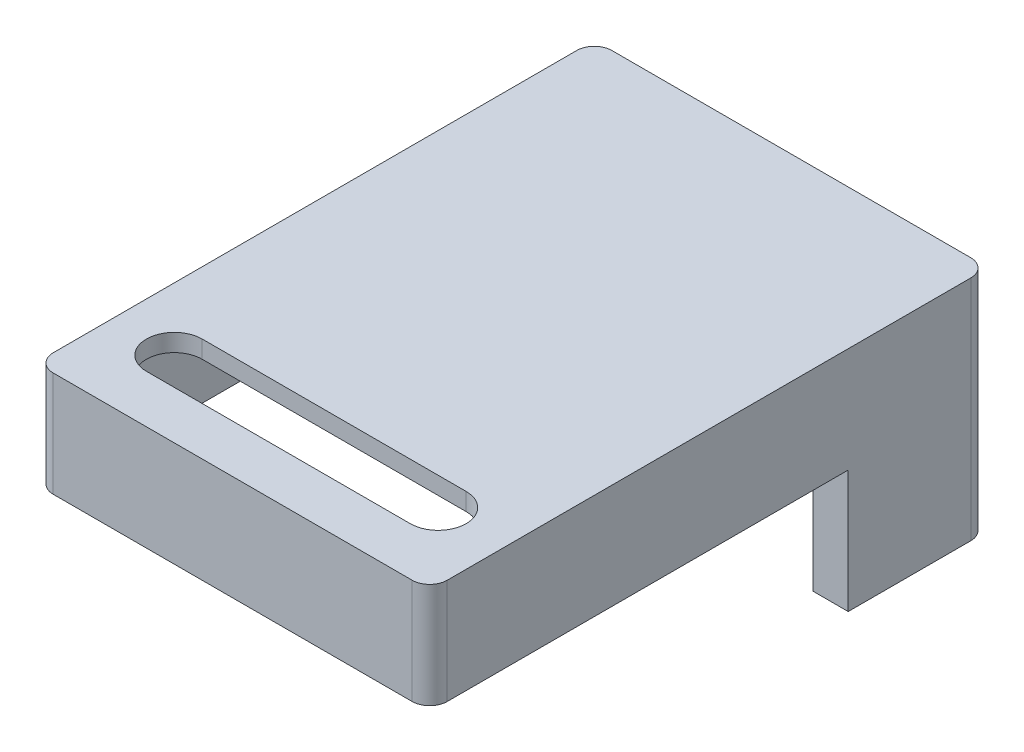
ISO-10303-21;
HEADER;
FILE_DESCRIPTION(('STEP AP214'),'2;1');
FILE_NAME('part.step','',(''),(''),'','','');
FILE_SCHEMA(('AUTOMOTIVE_DESIGN { 1 0 10303 214 1 1 1 1 }'));
ENDSEC;
DATA;
#1=APPLICATION_CONTEXT('core data for automotive mechanical design processes');
#2=APPLICATION_PROTOCOL_DEFINITION('international standard','automotive_design',2000,#1);
#3=PRODUCT_CONTEXT('',#1,'mechanical');
#4=PRODUCT('Part','Part','',(#3));
#5=PRODUCT_RELATED_PRODUCT_CATEGORY('part','',(#4));
#6=PRODUCT_DEFINITION_FORMATION('','',#4);
#7=PRODUCT_DEFINITION_CONTEXT('part definition',#1,'design');
#8=PRODUCT_DEFINITION('design','',#6,#7);
#9=PRODUCT_DEFINITION_SHAPE('','',#8);
#10=(LENGTH_UNIT() NAMED_UNIT(*) SI_UNIT(.MILLI.,.METRE.));
#11=(NAMED_UNIT(*) PLANE_ANGLE_UNIT() SI_UNIT($,.RADIAN.));
#12=(NAMED_UNIT(*) SI_UNIT($,.STERADIAN.) SOLID_ANGLE_UNIT());
#13=UNCERTAINTY_MEASURE_WITH_UNIT(LENGTH_MEASURE(1.E-05),#10,'distance_accuracy_value','');
#14=(GEOMETRIC_REPRESENTATION_CONTEXT(3) GLOBAL_UNCERTAINTY_ASSIGNED_CONTEXT((#13)) GLOBAL_UNIT_ASSIGNED_CONTEXT((#10,
#11,#12)) REPRESENTATION_CONTEXT('',''));
#15=CARTESIAN_POINT('',(0.,0.,0.));
#16=DIRECTION('',(0.,0.,1.));
#17=DIRECTION('',(1.,0.,0.));
#18=AXIS2_PLACEMENT_3D('',#15,#16,#17);
#19=CARTESIAN_POINT('',(0.,0.,0.));
#20=DIRECTION('',(0.,1.,0.));
#21=DIRECTION('',(0.,0.,1.));
#22=AXIS2_PLACEMENT_3D('',#19,#20,#21);
#23=PLANE('',#22);
#24=DIRECTION('',(-1.,0.,0.));
#25=VECTOR('',#24,1.);
#26=CARTESIAN_POINT('',(0.,0.,-15.));
#27=LINE('',#26,#25);
#28=CARTESIAN_POINT('',(-10.5,0.,-15.));
#29=VERTEX_POINT('',#28);
#30=CARTESIAN_POINT('',(-11.25,0.,-15.));
#31=VERTEX_POINT('',#30);
#32=EDGE_CURVE('E275',#29,#31,#27,.T.);
#33=ORIENTED_EDGE('',*,*,#32,.F.);
#34=DIRECTION('',(0.,0.,1.));
#35=VECTOR('',#34,1.);
#36=CARTESIAN_POINT('',(-10.5,0.,0.));
#37=LINE('',#36,#35);
#38=CARTESIAN_POINT('',(-10.5,0.,7.65));
#39=VERTEX_POINT('',#38);
#40=EDGE_CURVE('E290',#29,#39,#37,.T.);
#41=ORIENTED_EDGE('',*,*,#40,.T.);
#42=CARTESIAN_POINT('',(-10.,0.,7.65));
#43=DIRECTION('',(0.,1.,0.));
#44=DIRECTION('',(0.,0.,1.));
#45=AXIS2_PLACEMENT_3D('',#42,#43,#44);
#46=CIRCLE('',#45,0.5);
#47=CARTESIAN_POINT('',(-10.,0.,8.15));
#48=VERTEX_POINT('',#47);
#49=EDGE_CURVE('E309',#39,#48,#46,.T.);
#50=ORIENTED_EDGE('',*,*,#49,.T.);
#51=DIRECTION('',(1.,0.,0.));
#52=VECTOR('',#51,1.);
#53=CARTESIAN_POINT('',(0.,0.,8.15));
#54=LINE('',#53,#52);
#55=CARTESIAN_POINT('',(10.,0.,8.15));
#56=VERTEX_POINT('',#55);
#57=EDGE_CURVE('E467',#48,#56,#54,.T.);
#58=ORIENTED_EDGE('',*,*,#57,.T.);
#59=CARTESIAN_POINT('',(10.,0.,7.65));
#60=DIRECTION('',(0.,1.,0.));
#61=DIRECTION('',(0.,0.,1.));
#62=AXIS2_PLACEMENT_3D('',#59,#60,#61);
#63=CIRCLE('',#62,0.5);
#64=CARTESIAN_POINT('',(10.5,0.,7.65));
#65=VERTEX_POINT('',#64);
#66=EDGE_CURVE('E464',#56,#65,#63,.T.);
#67=ORIENTED_EDGE('',*,*,#66,.T.);
#68=DIRECTION('',(0.,0.,1.));
#69=VECTOR('',#68,1.);
#70=CARTESIAN_POINT('',(10.5,0.,0.));
#71=LINE('',#70,#69);
#72=CARTESIAN_POINT('',(10.5,0.,-15.));
#73=VERTEX_POINT('',#72);
#74=EDGE_CURVE('E286',#73,#65,#71,.T.);
#75=ORIENTED_EDGE('',*,*,#74,.F.);
#76=DIRECTION('',(1.,0.,0.));
#77=VECTOR('',#76,1.);
#78=CARTESIAN_POINT('',(0.,0.,-15.));
#79=LINE('',#78,#77);
#80=CARTESIAN_POINT('',(11.25,0.,-15.));
#81=VERTEX_POINT('',#80);
#82=EDGE_CURVE('E279',#73,#81,#79,.T.);
#83=ORIENTED_EDGE('',*,*,#82,.T.);
#84=DIRECTION('',(0.,0.,1.));
#85=VECTOR('',#84,1.);
#86=CARTESIAN_POINT('',(11.25,0.,0.));
#87=LINE('',#86,#85);
#88=CARTESIAN_POINT('',(11.25,0.,7.9000000000056));
#89=VERTEX_POINT('',#88);
#90=EDGE_CURVE('E451',#81,#89,#87,.T.);
#91=ORIENTED_EDGE('',*,*,#90,.T.);
#92=CARTESIAN_POINT('',(10.25,0.,7.90000000000561));
#93=DIRECTION('',(0.,1.,0.));
#94=DIRECTION('',(0.,0.,1.));
#95=AXIS2_PLACEMENT_3D('',#92,#93,#94);
#96=CIRCLE('',#95,1.);
#97=CARTESIAN_POINT('',(10.25,0.,8.90000000000561));
#98=VERTEX_POINT('',#97);
#99=EDGE_CURVE('E460',#89,#98,#96,.F.);
#100=ORIENTED_EDGE('',*,*,#99,.T.);
#101=DIRECTION('',(1.,0.,0.));
#102=VECTOR('',#101,1.);
#103=CARTESIAN_POINT('',(0.,0.,8.90000000000561));
#104=LINE('',#103,#102);
#105=CARTESIAN_POINT('',(-10.25,0.,8.90000000000561));
#106=VERTEX_POINT('',#105);
#107=EDGE_CURVE('E444',#106,#98,#104,.T.);
#108=ORIENTED_EDGE('',*,*,#107,.F.);
#109=CARTESIAN_POINT('',(-10.25,0.,7.90000000000561));
#110=DIRECTION('',(0.,1.,0.));
#111=DIRECTION('',(0.,0.,1.));
#112=AXIS2_PLACEMENT_3D('',#109,#110,#111);
#113=CIRCLE('',#112,1.);
#114=CARTESIAN_POINT('',(-11.25,0.,7.9000000000056));
#115=VERTEX_POINT('',#114);
#116=EDGE_CURVE('E442',#115,#106,#113,.T.);
#117=ORIENTED_EDGE('',*,*,#116,.F.);
#118=DIRECTION('',(0.,0.,1.));
#119=VECTOR('',#118,1.);
#120=CARTESIAN_POINT('',(-11.25,0.,0.));
#121=LINE('',#120,#119);
#122=EDGE_CURVE('E438',#31,#115,#121,.T.);
#123=ORIENTED_EDGE('',*,*,#122,.F.);
#124=EDGE_LOOP('',(#33,#41,#50,#58,#67,#75,#83,#91,#100,#108,#117,#123));
#125=FACE_BOUND('',#124,.T.);
#126=ADVANCED_FACE('F34',(#125),#23,.F.);
#127=CARTESIAN_POINT('',(10.,5.,7.65));
#128=DIRECTION('',(0.,-1.,0.));
#129=DIRECTION('',(0.,0.,-1.));
#130=AXIS2_PLACEMENT_3D('',#127,#128,#129);
#131=CYLINDRICAL_SURFACE('',#130,0.5);
#132=ORIENTED_EDGE('',*,*,#66,.F.);
#133=DIRECTION('',(0.,-1.,0.));
#134=VECTOR('',#133,1.);
#135=CARTESIAN_POINT('',(10.,5.,8.15));
#136=LINE('',#135,#134);
#137=CARTESIAN_POINT('',(10.,5.,8.15));
#138=VERTEX_POINT('',#137);
#139=EDGE_CURVE('E486',#138,#56,#136,.T.);
#140=ORIENTED_EDGE('',*,*,#139,.F.);
#141=CARTESIAN_POINT('',(10.,5.,7.65));
#142=DIRECTION('',(0.,1.,0.));
#143=DIRECTION('',(0.,0.,1.));
#144=AXIS2_PLACEMENT_3D('',#141,#142,#143);
#145=CIRCLE('',#144,0.5);
#146=CARTESIAN_POINT('',(10.5,5.,7.65));
#147=VERTEX_POINT('',#146);
#148=EDGE_CURVE('E289',#138,#147,#145,.T.);
#149=ORIENTED_EDGE('',*,*,#148,.T.);
#150=DIRECTION('',(0.,-1.,0.));
#151=VECTOR('',#150,1.);
#152=CARTESIAN_POINT('',(10.5,5.,7.65));
#153=LINE('',#152,#151);
#154=EDGE_CURVE('E297',#147,#65,#153,.T.);
#155=ORIENTED_EDGE('',*,*,#154,.T.);
#156=EDGE_LOOP('',(#132,#140,#149,#155));
#157=FACE_BOUND('',#156,.T.);
#158=ADVANCED_FACE('F337',(#157),#131,.F.);
#159=CARTESIAN_POINT('',(0.,5.,8.15));
#160=DIRECTION('',(0.,0.,-1.));
#161=DIRECTION('',(-1.,0.,0.));
#162=AXIS2_PLACEMENT_3D('',#159,#160,#161);
#163=PLANE('',#162);
#164=ORIENTED_EDGE('',*,*,#57,.F.);
#165=DIRECTION('',(0.,-1.,0.));
#166=VECTOR('',#165,1.);
#167=CARTESIAN_POINT('',(-10.,5.,8.15));
#168=LINE('',#167,#166);
#169=CARTESIAN_POINT('',(-10.,5.,8.15));
#170=VERTEX_POINT('',#169);
#171=EDGE_CURVE('E484',#170,#48,#168,.T.);
#172=ORIENTED_EDGE('',*,*,#171,.F.);
#173=DIRECTION('',(1.,0.,0.));
#174=VECTOR('',#173,1.);
#175=CARTESIAN_POINT('',(0.,5.,8.15));
#176=LINE('',#175,#174);
#177=EDGE_CURVE('E521',#170,#138,#176,.T.);
#178=ORIENTED_EDGE('',*,*,#177,.T.);
#179=ORIENTED_EDGE('',*,*,#139,.T.);
#180=EDGE_LOOP('',(#164,#172,#178,#179));
#181=FACE_BOUND('',#180,.T.);
#182=ADVANCED_FACE('F343',(#181),#163,.T.);
#183=CARTESIAN_POINT('',(-10.,5.,7.65));
#184=DIRECTION('',(0.,-1.,0.));
#185=DIRECTION('',(0.,0.,-1.));
#186=AXIS2_PLACEMENT_3D('',#183,#184,#185);
#187=CYLINDRICAL_SURFACE('',#186,0.5);
#188=ORIENTED_EDGE('',*,*,#49,.F.);
#189=DIRECTION('',(0.,-1.,0.));
#190=VECTOR('',#189,1.);
#191=CARTESIAN_POINT('',(-10.5,5.,7.65));
#192=LINE('',#191,#190);
#193=CARTESIAN_POINT('',(-10.5,5.,7.65));
#194=VERTEX_POINT('',#193);
#195=EDGE_CURVE('E303',#194,#39,#192,.T.);
#196=ORIENTED_EDGE('',*,*,#195,.F.);
#197=CARTESIAN_POINT('',(-10.,5.,7.65));
#198=DIRECTION('',(0.,1.,0.));
#199=DIRECTION('',(0.,0.,1.));
#200=AXIS2_PLACEMENT_3D('',#197,#198,#199);
#201=CIRCLE('',#200,0.5);
#202=EDGE_CURVE('E524',#194,#170,#201,.T.);
#203=ORIENTED_EDGE('',*,*,#202,.T.);
#204=ORIENTED_EDGE('',*,*,#171,.T.);
#205=EDGE_LOOP('',(#188,#196,#203,#204));
#206=FACE_BOUND('',#205,.T.);
#207=ADVANCED_FACE('F385',(#206),#187,.F.);
#208=CARTESIAN_POINT('',(-10.5,5.,0.));
#209=DIRECTION('',(1.,0.,0.));
#210=DIRECTION('',(0.,0.,-1.));
#211=AXIS2_PLACEMENT_3D('',#208,#209,#210);
#212=PLANE('',#211);
#213=ORIENTED_EDGE('',*,*,#40,.F.);
#214=DIRECTION('',(0.,-1.,0.));
#215=VECTOR('',#214,1.);
#216=CARTESIAN_POINT('',(-10.5,5.,-15.));
#217=LINE('',#216,#215);
#218=CARTESIAN_POINT('',(-10.5,5.,-15.));
#219=VERTEX_POINT('',#218);
#220=EDGE_CURVE('E300',#219,#29,#217,.T.);
#221=ORIENTED_EDGE('',*,*,#220,.F.);
#222=DIRECTION('',(0.,0.,1.));
#223=VECTOR('',#222,1.);
#224=CARTESIAN_POINT('',(-10.5,5.,0.));
#225=LINE('',#224,#223);
#226=EDGE_CURVE('E527',#219,#194,#225,.T.);
#227=ORIENTED_EDGE('',*,*,#226,.T.);
#228=ORIENTED_EDGE('',*,*,#195,.T.);
#229=EDGE_LOOP('',(#213,#221,#227,#228));
#230=FACE_BOUND('',#229,.T.);
#231=ADVANCED_FACE('F381',(#230),#212,.T.);
#232=CARTESIAN_POINT('',(0.,5.,-15.));
#233=DIRECTION('',(0.,0.,1.));
#234=DIRECTION('',(1.,0.,0.));
#235=AXIS2_PLACEMENT_3D('',#232,#233,#234);
#236=PLANE('',#235);
#237=ORIENTED_EDGE('',*,*,#220,.T.);
#238=ORIENTED_EDGE('',*,*,#32,.T.);
#239=DIRECTION('',(0.,1.,0.));
#240=VECTOR('',#239,1.);
#241=CARTESIAN_POINT('',(-11.25,-7.,-15.));
#242=LINE('',#241,#240);
#243=CARTESIAN_POINT('',(-11.25,-7.,-15.));
#244=VERTEX_POINT('',#243);
#245=EDGE_CURVE('E269',#244,#31,#242,.T.);
#246=ORIENTED_EDGE('',*,*,#245,.F.);
#247=DIRECTION('',(-1.,0.,0.));
#248=VECTOR('',#247,1.);
#249=CARTESIAN_POINT('',(0.,-7.,-15.));
#250=LINE('',#249,#248);
#251=CARTESIAN_POINT('',(-9.25,-7.,-15.));
#252=VERTEX_POINT('',#251);
#253=EDGE_CURVE('E247',#252,#244,#250,.T.);
#254=ORIENTED_EDGE('',*,*,#253,.F.);
#255=DIRECTION('',(0.,-1.,0.));
#256=VECTOR('',#255,1.);
#257=CARTESIAN_POINT('',(-9.25,5.,-15.));
#258=LINE('',#257,#256);
#259=CARTESIAN_POINT('',(-9.25,5.,-15.));
#260=VERTEX_POINT('',#259);
#261=EDGE_CURVE('E304',#260,#252,#258,.T.);
#262=ORIENTED_EDGE('',*,*,#261,.F.);
#263=DIRECTION('',(-1.,0.,0.));
#264=VECTOR('',#263,1.);
#265=CARTESIAN_POINT('',(0.,5.,-15.));
#266=LINE('',#265,#264);
#267=EDGE_CURVE('E530',#260,#219,#266,.T.);
#268=ORIENTED_EDGE('',*,*,#267,.T.);
#269=EDGE_LOOP('',(#237,#238,#246,#254,#262,#268));
#270=FACE_BOUND('',#269,.T.);
#271=ADVANCED_FACE('F377',(#270),#236,.T.);
#272=CARTESIAN_POINT('',(-9.24999999999999,5.,0.));
#273=DIRECTION('',(1.,0.,0.));
#274=DIRECTION('',(0.,0.,-1.));
#275=AXIS2_PLACEMENT_3D('',#272,#273,#274);
#276=PLANE('',#275);
#277=ORIENTED_EDGE('',*,*,#261,.T.);
#278=DIRECTION('',(0.,0.,1.));
#279=VECTOR('',#278,1.);
#280=CARTESIAN_POINT('',(-9.24999999999999,-7.,0.));
#281=LINE('',#280,#279);
#282=CARTESIAN_POINT('',(-9.25,-7.,-21.75));
#283=VERTEX_POINT('',#282);
#284=EDGE_CURVE('E249',#283,#252,#281,.T.);
#285=ORIENTED_EDGE('',*,*,#284,.F.);
#286=DIRECTION('',(0.,-1.,0.));
#287=VECTOR('',#286,1.);
#288=CARTESIAN_POINT('',(-9.25,5.,-21.75));
#289=LINE('',#288,#287);
#290=CARTESIAN_POINT('',(-9.25,5.,-21.75));
#291=VERTEX_POINT('',#290);
#292=EDGE_CURVE('E480',#291,#283,#289,.T.);
#293=ORIENTED_EDGE('',*,*,#292,.F.);
#294=DIRECTION('',(0.,0.,1.));
#295=VECTOR('',#294,1.);
#296=CARTESIAN_POINT('',(-9.24999999999999,5.,0.));
#297=LINE('',#296,#295);
#298=EDGE_CURVE('E533',#291,#260,#297,.T.);
#299=ORIENTED_EDGE('',*,*,#298,.T.);
#300=EDGE_LOOP('',(#277,#285,#293,#299));
#301=FACE_BOUND('',#300,.T.);
#302=ADVANCED_FACE('F373',(#301),#276,.T.);
#303=CARTESIAN_POINT('',(-8.75,5.,-21.75));
#304=DIRECTION('',(0.,-1.,0.));
#305=DIRECTION('',(0.,0.,-1.));
#306=AXIS2_PLACEMENT_3D('',#303,#304,#305);
#307=CYLINDRICAL_SURFACE('',#306,0.5);
#308=ORIENTED_EDGE('',*,*,#292,.T.);
#309=CARTESIAN_POINT('',(-8.75,-7.,-21.75));
#310=DIRECTION('',(0.,1.,0.));
#311=DIRECTION('',(0.,0.,1.));
#312=AXIS2_PLACEMENT_3D('',#309,#310,#311);
#313=CIRCLE('',#312,0.5);
#314=CARTESIAN_POINT('',(-8.75,-7.,-22.25));
#315=VERTEX_POINT('',#314);
#316=EDGE_CURVE('E252',#315,#283,#313,.T.);
#317=ORIENTED_EDGE('',*,*,#316,.F.);
#318=DIRECTION('',(0.,-1.,0.));
#319=VECTOR('',#318,1.);
#320=CARTESIAN_POINT('',(-8.75,5.,-22.25));
#321=LINE('',#320,#319);
#322=CARTESIAN_POINT('',(-8.75,5.,-22.25));
#323=VERTEX_POINT('',#322);
#324=EDGE_CURVE('E478',#323,#315,#321,.T.);
#325=ORIENTED_EDGE('',*,*,#324,.F.);
#326=CARTESIAN_POINT('',(-8.75,5.,-21.75));
#327=DIRECTION('',(0.,1.,0.));
#328=DIRECTION('',(0.,0.,1.));
#329=AXIS2_PLACEMENT_3D('',#326,#327,#328);
#330=CIRCLE('',#329,0.5);
#331=EDGE_CURVE('E536',#323,#291,#330,.T.);
#332=ORIENTED_EDGE('',*,*,#331,.T.);
#333=EDGE_LOOP('',(#308,#317,#325,#332));
#334=FACE_BOUND('',#333,.T.);
#335=ADVANCED_FACE('F369',(#334),#307,.F.);
#336=CARTESIAN_POINT('',(0.,5.,-22.25));
#337=DIRECTION('',(0.,0.,-1.));
#338=DIRECTION('',(-1.,0.,0.));
#339=AXIS2_PLACEMENT_3D('',#336,#337,#338);
#340=PLANE('',#339);
#341=ORIENTED_EDGE('',*,*,#324,.T.);
#342=DIRECTION('',(1.,0.,0.));
#343=VECTOR('',#342,1.);
#344=CARTESIAN_POINT('',(0.,-7.,-22.25));
#345=LINE('',#344,#343);
#346=CARTESIAN_POINT('',(8.74999999999999,-7.,-22.25));
#347=VERTEX_POINT('',#346);
#348=EDGE_CURVE('E255',#315,#347,#345,.T.);
#349=ORIENTED_EDGE('',*,*,#348,.T.);
#350=DIRECTION('',(0.,-1.,0.));
#351=VECTOR('',#350,1.);
#352=CARTESIAN_POINT('',(8.74999999999999,5.,-22.25));
#353=LINE('',#352,#351);
#354=CARTESIAN_POINT('',(8.74999999999999,5.,-22.25));
#355=VERTEX_POINT('',#354);
#356=EDGE_CURVE('E476',#355,#347,#353,.T.);
#357=ORIENTED_EDGE('',*,*,#356,.F.);
#358=DIRECTION('',(1.,0.,0.));
#359=VECTOR('',#358,1.);
#360=CARTESIAN_POINT('',(0.,5.,-22.25));
#361=LINE('',#360,#359);
#362=EDGE_CURVE('E539',#323,#355,#361,.T.);
#363=ORIENTED_EDGE('',*,*,#362,.F.);
#364=EDGE_LOOP('',(#341,#349,#357,#363));
#365=FACE_BOUND('',#364,.T.);
#366=ADVANCED_FACE('F365',(#365),#340,.F.);
#367=CARTESIAN_POINT('',(8.75,5.,-21.75));
#368=DIRECTION('',(0.,-1.,0.));
#369=DIRECTION('',(0.,0.,-1.));
#370=AXIS2_PLACEMENT_3D('',#367,#368,#369);
#371=CYLINDRICAL_SURFACE('',#370,0.5);
#372=ORIENTED_EDGE('',*,*,#356,.T.);
#373=CARTESIAN_POINT('',(8.75,-7.,-21.75));
#374=DIRECTION('',(0.,1.,0.));
#375=DIRECTION('',(0.,0.,1.));
#376=AXIS2_PLACEMENT_3D('',#373,#374,#375);
#377=CIRCLE('',#376,0.5);
#378=CARTESIAN_POINT('',(9.25,-7.,-21.75));
#379=VERTEX_POINT('',#378);
#380=EDGE_CURVE('E258',#379,#347,#377,.T.);
#381=ORIENTED_EDGE('',*,*,#380,.F.);
#382=DIRECTION('',(0.,-1.,0.));
#383=VECTOR('',#382,1.);
#384=CARTESIAN_POINT('',(9.25,5.,-21.75));
#385=LINE('',#384,#383);
#386=CARTESIAN_POINT('',(9.25,5.,-21.75));
#387=VERTEX_POINT('',#386);
#388=EDGE_CURVE('E474',#387,#379,#385,.T.);
#389=ORIENTED_EDGE('',*,*,#388,.F.);
#390=CARTESIAN_POINT('',(8.75,5.,-21.75));
#391=DIRECTION('',(0.,1.,0.));
#392=DIRECTION('',(0.,0.,1.));
#393=AXIS2_PLACEMENT_3D('',#390,#391,#392);
#394=CIRCLE('',#393,0.5);
#395=EDGE_CURVE('E542',#387,#355,#394,.T.);
#396=ORIENTED_EDGE('',*,*,#395,.T.);
#397=EDGE_LOOP('',(#372,#381,#389,#396));
#398=FACE_BOUND('',#397,.T.);
#399=ADVANCED_FACE('F361',(#398),#371,.F.);
#400=CARTESIAN_POINT('',(9.25,5.,0.));
#401=DIRECTION('',(1.,0.,0.));
#402=DIRECTION('',(0.,0.,-1.));
#403=AXIS2_PLACEMENT_3D('',#400,#401,#402);
#404=PLANE('',#403);
#405=ORIENTED_EDGE('',*,*,#388,.T.);
#406=DIRECTION('',(0.,0.,1.));
#407=VECTOR('',#406,1.);
#408=CARTESIAN_POINT('',(9.25,-7.,0.));
#409=LINE('',#408,#407);
#410=CARTESIAN_POINT('',(9.25,-7.,-15.));
#411=VERTEX_POINT('',#410);
#412=EDGE_CURVE('E261',#379,#411,#409,.T.);
#413=ORIENTED_EDGE('',*,*,#412,.T.);
#414=DIRECTION('',(0.,-1.,0.));
#415=VECTOR('',#414,1.);
#416=CARTESIAN_POINT('',(9.25,5.,-15.));
#417=LINE('',#416,#415);
#418=CARTESIAN_POINT('',(9.25,5.,-15.));
#419=VERTEX_POINT('',#418);
#420=EDGE_CURVE('E296',#419,#411,#417,.T.);
#421=ORIENTED_EDGE('',*,*,#420,.F.);
#422=DIRECTION('',(0.,0.,1.));
#423=VECTOR('',#422,1.);
#424=CARTESIAN_POINT('',(9.25,5.,0.));
#425=LINE('',#424,#423);
#426=EDGE_CURVE('E545',#387,#419,#425,.T.);
#427=ORIENTED_EDGE('',*,*,#426,.F.);
#428=EDGE_LOOP('',(#405,#413,#421,#427));
#429=FACE_BOUND('',#428,.T.);
#430=ADVANCED_FACE('F357',(#429),#404,.F.);
#431=CARTESIAN_POINT('',(0.,5.,-15.));
#432=DIRECTION('',(0.,0.,-1.));
#433=DIRECTION('',(-1.,0.,0.));
#434=AXIS2_PLACEMENT_3D('',#431,#432,#433);
#435=PLANE('',#434);
#436=ORIENTED_EDGE('',*,*,#420,.T.);
#437=DIRECTION('',(1.,0.,0.));
#438=VECTOR('',#437,1.);
#439=CARTESIAN_POINT('',(0.,-7.,-15.));
#440=LINE('',#439,#438);
#441=CARTESIAN_POINT('',(11.25,-7.,-15.));
#442=VERTEX_POINT('',#441);
#443=EDGE_CURVE('E264',#411,#442,#440,.T.);
#444=ORIENTED_EDGE('',*,*,#443,.T.);
#445=DIRECTION('',(0.,1.,0.));
#446=VECTOR('',#445,1.);
#447=CARTESIAN_POINT('',(11.25,-7.,-15.));
#448=LINE('',#447,#446);
#449=EDGE_CURVE('E281',#442,#81,#448,.T.);
#450=ORIENTED_EDGE('',*,*,#449,.T.);
#451=ORIENTED_EDGE('',*,*,#82,.F.);
#452=DIRECTION('',(0.,-1.,0.));
#453=VECTOR('',#452,1.);
#454=CARTESIAN_POINT('',(10.5,5.,-15.));
#455=LINE('',#454,#453);
#456=CARTESIAN_POINT('',(10.5,5.,-15.));
#457=VERTEX_POINT('',#456);
#458=EDGE_CURVE('E293',#457,#73,#455,.T.);
#459=ORIENTED_EDGE('',*,*,#458,.F.);
#460=DIRECTION('',(1.,0.,0.));
#461=VECTOR('',#460,1.);
#462=CARTESIAN_POINT('',(0.,5.,-15.));
#463=LINE('',#462,#461);
#464=EDGE_CURVE('E547',#419,#457,#463,.T.);
#465=ORIENTED_EDGE('',*,*,#464,.F.);
#466=EDGE_LOOP('',(#436,#444,#450,#451,#459,#465));
#467=FACE_BOUND('',#466,.T.);
#468=ADVANCED_FACE('F354',(#467),#435,.F.);
#469=CARTESIAN_POINT('',(-10.25,5.,-22.));
#470=DIRECTION('',(0.,-1.,0.));
#471=DIRECTION('',(0.,0.,-1.));
#472=AXIS2_PLACEMENT_3D('',#469,#470,#471);
#473=CYLINDRICAL_SURFACE('',#472,1.);
#474=DIRECTION('',(0.,-1.,0.));
#475=VECTOR('',#474,1.);
#476=CARTESIAN_POINT('',(-10.25,5.,-23.));
#477=LINE('',#476,#475);
#478=CARTESIAN_POINT('',(-10.25,6.,-23.));
#479=VERTEX_POINT('',#478);
#480=CARTESIAN_POINT('',(-10.25,-7.,-23.));
#481=VERTEX_POINT('',#480);
#482=EDGE_CURVE('E432',#479,#481,#477,.T.);
#483=ORIENTED_EDGE('',*,*,#482,.T.);
#484=CARTESIAN_POINT('',(-10.25,-7.,-22.));
#485=DIRECTION('',(0.,1.,0.));
#486=DIRECTION('',(0.,0.,1.));
#487=AXIS2_PLACEMENT_3D('',#484,#485,#486);
#488=CIRCLE('',#487,1.);
#489=CARTESIAN_POINT('',(-11.25,-7.,-22.));
#490=VERTEX_POINT('',#489);
#491=EDGE_CURVE('E241',#490,#481,#488,.F.);
#492=ORIENTED_EDGE('',*,*,#491,.F.);
#493=DIRECTION('',(0.,-1.,0.));
#494=VECTOR('',#493,1.);
#495=CARTESIAN_POINT('',(-11.25,5.,-22.));
#496=LINE('',#495,#494);
#497=CARTESIAN_POINT('',(-11.25,6.,-22.));
#498=VERTEX_POINT('',#497);
#499=EDGE_CURVE('E423',#498,#490,#496,.T.);
#500=ORIENTED_EDGE('',*,*,#499,.F.);
#501=CARTESIAN_POINT('',(-10.25,6.,-22.));
#502=DIRECTION('',(0.,1.,0.));
#503=DIRECTION('',(0.,0.,1.));
#504=AXIS2_PLACEMENT_3D('',#501,#502,#503);
#505=CIRCLE('',#504,1.);
#506=EDGE_CURVE('E283',#498,#479,#505,.F.);
#507=ORIENTED_EDGE('',*,*,#506,.T.);
#508=EDGE_LOOP('',(#483,#492,#500,#507));
#509=FACE_BOUND('',#508,.T.);
#510=ADVANCED_FACE('F36',(#509),#473,.T.);
#511=CARTESIAN_POINT('',(-11.25,5.,0.));
#512=DIRECTION('',(1.,0.,0.));
#513=DIRECTION('',(0.,0.,-1.));
#514=AXIS2_PLACEMENT_3D('',#511,#512,#513);
#515=PLANE('',#514);
#516=ORIENTED_EDGE('',*,*,#499,.T.);
#517=DIRECTION('',(0.,0.,1.));
#518=VECTOR('',#517,1.);
#519=CARTESIAN_POINT('',(-11.25,-7.,0.));
#520=LINE('',#519,#518);
#521=EDGE_CURVE('E244',#490,#244,#520,.T.);
#522=ORIENTED_EDGE('',*,*,#521,.T.);
#523=ORIENTED_EDGE('',*,*,#245,.T.);
#524=ORIENTED_EDGE('',*,*,#122,.T.);
#525=DIRECTION('',(0.,-1.,0.));
#526=VECTOR('',#525,1.);
#527=CARTESIAN_POINT('',(-11.25,5.,7.9000000000056));
#528=LINE('',#527,#526);
#529=CARTESIAN_POINT('',(-11.25,6.,7.9000000000056));
#530=VERTEX_POINT('',#529);
#531=EDGE_CURVE('E430',#530,#115,#528,.T.);
#532=ORIENTED_EDGE('',*,*,#531,.F.);
#533=DIRECTION('',(0.,0.,1.));
#534=VECTOR('',#533,1.);
#535=CARTESIAN_POINT('',(-11.25,6.,0.));
#536=LINE('',#535,#534);
#537=EDGE_CURVE('E427',#498,#530,#536,.T.);
#538=ORIENTED_EDGE('',*,*,#537,.F.);
#539=EDGE_LOOP('',(#516,#522,#523,#524,#532,#538));
#540=FACE_BOUND('',#539,.T.);
#541=ADVANCED_FACE('F414',(#540),#515,.F.);
#542=CARTESIAN_POINT('',(-10.25,5.,7.90000000000561));
#543=DIRECTION('',(0.,-1.,0.));
#544=DIRECTION('',(0.,0.,-1.));
#545=AXIS2_PLACEMENT_3D('',#542,#543,#544);
#546=CYLINDRICAL_SURFACE('',#545,1.);
#547=ORIENTED_EDGE('',*,*,#116,.T.);
#548=DIRECTION('',(0.,-1.,0.));
#549=VECTOR('',#548,1.);
#550=CARTESIAN_POINT('',(-10.25,5.,8.90000000000561));
#551=LINE('',#550,#549);
#552=CARTESIAN_POINT('',(-10.25,6.,8.90000000000561));
#553=VERTEX_POINT('',#552);
#554=EDGE_CURVE('E498',#553,#106,#551,.T.);
#555=ORIENTED_EDGE('',*,*,#554,.F.);
#556=CARTESIAN_POINT('',(-10.25,6.,7.90000000000561));
#557=DIRECTION('',(0.,1.,0.));
#558=DIRECTION('',(0.,0.,1.));
#559=AXIS2_PLACEMENT_3D('',#556,#557,#558);
#560=CIRCLE('',#559,1.);
#561=EDGE_CURVE('E503',#530,#553,#560,.T.);
#562=ORIENTED_EDGE('',*,*,#561,.F.);
#563=ORIENTED_EDGE('',*,*,#531,.T.);
#564=EDGE_LOOP('',(#547,#555,#562,#563));
#565=FACE_BOUND('',#564,.T.);
#566=ADVANCED_FACE('F411',(#565),#546,.T.);
#567=CARTESIAN_POINT('',(0.,5.,8.90000000000561));
#568=DIRECTION('',(0.,0.,-1.));
#569=DIRECTION('',(-1.,0.,0.));
#570=AXIS2_PLACEMENT_3D('',#567,#568,#569);
#571=PLANE('',#570);
#572=ORIENTED_EDGE('',*,*,#107,.T.);
#573=DIRECTION('',(0.,-1.,0.));
#574=VECTOR('',#573,1.);
#575=CARTESIAN_POINT('',(10.25,5.,8.90000000000561));
#576=LINE('',#575,#574);
#577=CARTESIAN_POINT('',(10.25,6.,8.90000000000561));
#578=VERTEX_POINT('',#577);
#579=EDGE_CURVE('E496',#578,#98,#576,.T.);
#580=ORIENTED_EDGE('',*,*,#579,.F.);
#581=DIRECTION('',(1.,0.,0.));
#582=VECTOR('',#581,1.);
#583=CARTESIAN_POINT('',(0.,6.,8.90000000000561));
#584=LINE('',#583,#582);
#585=EDGE_CURVE('E508',#553,#578,#584,.T.);
#586=ORIENTED_EDGE('',*,*,#585,.F.);
#587=ORIENTED_EDGE('',*,*,#554,.T.);
#588=EDGE_LOOP('',(#572,#580,#586,#587));
#589=FACE_BOUND('',#588,.T.);
#590=ADVANCED_FACE('F407',(#589),#571,.F.);
#591=CARTESIAN_POINT('',(10.25,5.,7.90000000000561));
#592=DIRECTION('',(0.,-1.,0.));
#593=DIRECTION('',(0.,0.,-1.));
#594=AXIS2_PLACEMENT_3D('',#591,#592,#593);
#595=CYLINDRICAL_SURFACE('',#594,1.);
#596=ORIENTED_EDGE('',*,*,#99,.F.);
#597=DIRECTION('',(0.,-1.,0.));
#598=VECTOR('',#597,1.);
#599=CARTESIAN_POINT('',(11.25,5.,7.9000000000056));
#600=LINE('',#599,#598);
#601=CARTESIAN_POINT('',(11.25,6.,7.9000000000056));
#602=VERTEX_POINT('',#601);
#603=EDGE_CURVE('E493',#602,#89,#600,.T.);
#604=ORIENTED_EDGE('',*,*,#603,.F.);
#605=CARTESIAN_POINT('',(10.25,6.,7.90000000000561));
#606=DIRECTION('',(0.,1.,0.));
#607=DIRECTION('',(0.,0.,1.));
#608=AXIS2_PLACEMENT_3D('',#605,#606,#607);
#609=CIRCLE('',#608,1.);
#610=EDGE_CURVE('E512',#602,#578,#609,.F.);
#611=ORIENTED_EDGE('',*,*,#610,.T.);
#612=ORIENTED_EDGE('',*,*,#579,.T.);
#613=EDGE_LOOP('',(#596,#604,#611,#612));
#614=FACE_BOUND('',#613,.T.);
#615=ADVANCED_FACE('F403',(#614),#595,.T.);
#616=CARTESIAN_POINT('',(11.25,5.,0.));
#617=DIRECTION('',(1.,0.,0.));
#618=DIRECTION('',(0.,0.,-1.));
#619=AXIS2_PLACEMENT_3D('',#616,#617,#618);
#620=PLANE('',#619);
#621=ORIENTED_EDGE('',*,*,#90,.F.);
#622=ORIENTED_EDGE('',*,*,#449,.F.);
#623=DIRECTION('',(0.,0.,1.));
#624=VECTOR('',#623,1.);
#625=CARTESIAN_POINT('',(11.25,-7.,0.));
#626=LINE('',#625,#624);
#627=CARTESIAN_POINT('',(11.25,-7.,-22.));
#628=VERTEX_POINT('',#627);
#629=EDGE_CURVE('E267',#628,#442,#626,.T.);
#630=ORIENTED_EDGE('',*,*,#629,.F.);
#631=DIRECTION('',(0.,-1.,0.));
#632=VECTOR('',#631,1.);
#633=CARTESIAN_POINT('',(11.25,5.,-22.));
#634=LINE('',#633,#632);
#635=CARTESIAN_POINT('',(11.25,6.,-22.));
#636=VERTEX_POINT('',#635);
#637=EDGE_CURVE('E491',#636,#628,#634,.T.);
#638=ORIENTED_EDGE('',*,*,#637,.F.);
#639=DIRECTION('',(0.,0.,1.));
#640=VECTOR('',#639,1.);
#641=CARTESIAN_POINT('',(11.25,6.,0.));
#642=LINE('',#641,#640);
#643=EDGE_CURVE('E515',#636,#602,#642,.T.);
#644=ORIENTED_EDGE('',*,*,#643,.T.);
#645=ORIENTED_EDGE('',*,*,#603,.T.);
#646=EDGE_LOOP('',(#621,#622,#630,#638,#644,#645));
#647=FACE_BOUND('',#646,.T.);
#648=ADVANCED_FACE('F399',(#647),#620,.T.);
#649=CARTESIAN_POINT('',(10.25,5.,-22.));
#650=DIRECTION('',(0.,-1.,0.));
#651=DIRECTION('',(0.,0.,-1.));
#652=AXIS2_PLACEMENT_3D('',#649,#650,#651);
#653=CYLINDRICAL_SURFACE('',#652,1.);
#654=ORIENTED_EDGE('',*,*,#637,.T.);
#655=CARTESIAN_POINT('',(10.25,-7.,-22.));
#656=DIRECTION('',(0.,1.,0.));
#657=DIRECTION('',(0.,0.,1.));
#658=AXIS2_PLACEMENT_3D('',#655,#656,#657);
#659=CIRCLE('',#658,1.);
#660=CARTESIAN_POINT('',(10.25,-7.,-23.));
#661=VERTEX_POINT('',#660);
#662=EDGE_CURVE('E233',#661,#628,#659,.F.);
#663=ORIENTED_EDGE('',*,*,#662,.F.);
#664=DIRECTION('',(0.,-1.,0.));
#665=VECTOR('',#664,1.);
#666=CARTESIAN_POINT('',(10.25,5.,-23.));
#667=LINE('',#666,#665);
#668=CARTESIAN_POINT('',(10.25,6.,-23.));
#669=VERTEX_POINT('',#668);
#670=EDGE_CURVE('E489',#669,#661,#667,.T.);
#671=ORIENTED_EDGE('',*,*,#670,.F.);
#672=CARTESIAN_POINT('',(10.25,6.,-22.));
#673=DIRECTION('',(0.,1.,0.));
#674=DIRECTION('',(0.,0.,1.));
#675=AXIS2_PLACEMENT_3D('',#672,#673,#674);
#676=CIRCLE('',#675,1.);
#677=EDGE_CURVE('E447',#669,#636,#676,.F.);
#678=ORIENTED_EDGE('',*,*,#677,.T.);
#679=EDGE_LOOP('',(#654,#663,#671,#678));
#680=FACE_BOUND('',#679,.T.);
#681=ADVANCED_FACE('F395',(#680),#653,.T.);
#682=CARTESIAN_POINT('',(0.,5.,-23.));
#683=DIRECTION('',(0.,0.,-1.));
#684=DIRECTION('',(-1.,0.,0.));
#685=AXIS2_PLACEMENT_3D('',#682,#683,#684);
#686=PLANE('',#685);
#687=ORIENTED_EDGE('',*,*,#670,.T.);
#688=DIRECTION('',(1.,0.,0.));
#689=VECTOR('',#688,1.);
#690=CARTESIAN_POINT('',(0.,-7.,-23.));
#691=LINE('',#690,#689);
#692=EDGE_CURVE('E238',#481,#661,#691,.T.);
#693=ORIENTED_EDGE('',*,*,#692,.F.);
#694=ORIENTED_EDGE('',*,*,#482,.F.);
#695=DIRECTION('',(1.,0.,0.));
#696=VECTOR('',#695,1.);
#697=CARTESIAN_POINT('',(0.,6.,-23.));
#698=LINE('',#697,#696);
#699=EDGE_CURVE('E443',#479,#669,#698,.T.);
#700=ORIENTED_EDGE('',*,*,#699,.T.);
#701=EDGE_LOOP('',(#687,#693,#694,#700));
#702=FACE_BOUND('',#701,.T.);
#703=ADVANCED_FACE('F352',(#702),#686,.T.);
#704=CARTESIAN_POINT('',(10.5,5.,0.));
#705=DIRECTION('',(1.,0.,0.));
#706=DIRECTION('',(0.,0.,-1.));
#707=AXIS2_PLACEMENT_3D('',#704,#705,#706);
#708=PLANE('',#707);
#709=ORIENTED_EDGE('',*,*,#74,.T.);
#710=ORIENTED_EDGE('',*,*,#154,.F.);
#711=DIRECTION('',(0.,0.,1.));
#712=VECTOR('',#711,1.);
#713=CARTESIAN_POINT('',(10.5,5.,0.));
#714=LINE('',#713,#712);
#715=EDGE_CURVE('E455',#457,#147,#714,.T.);
#716=ORIENTED_EDGE('',*,*,#715,.F.);
#717=ORIENTED_EDGE('',*,*,#458,.T.);
#718=EDGE_LOOP('',(#709,#710,#716,#717));
#719=FACE_BOUND('',#718,.T.);
#720=ADVANCED_FACE('F349',(#719),#708,.F.);
#721=CARTESIAN_POINT('',(0.,6.,0.));
#722=DIRECTION('',(0.,1.,0.));
#723=DIRECTION('',(0.,0.,1.));
#724=AXIS2_PLACEMENT_3D('',#721,#722,#723);
#725=PLANE('',#724);
#726=CARTESIAN_POINT('',(-7.67234544259269,6.,4.56192500449104));
#727=DIRECTION('',(0.,1.,0.));
#728=DIRECTION('',(0.,0.,1.));
#729=AXIS2_PLACEMENT_3D('',#726,#727,#728);
#730=CIRCLE('',#729,1.59518584776225);
#731=CARTESIAN_POINT('',(-7.67234544259269,6.,2.96673915672879));
#732=VERTEX_POINT('',#731);
#733=CARTESIAN_POINT('',(-7.67234544259269,6.,6.15711085225329));
#734=VERTEX_POINT('',#733);
#735=EDGE_CURVE('E49',#732,#734,#730,.T.);
#736=ORIENTED_EDGE('',*,*,#735,.F.);
#737=DIRECTION('',(-1.,0.,0.));
#738=VECTOR('',#737,1.);
#739=CARTESIAN_POINT('',(-7.67234544259269,6.,2.96673915672879));
#740=LINE('',#739,#738);
#741=CARTESIAN_POINT('',(7.39782559030539,6.,2.96673915672879));
#742=VERTEX_POINT('',#741);
#743=EDGE_CURVE('E226',#742,#732,#740,.T.);
#744=ORIENTED_EDGE('',*,*,#743,.F.);
#745=CARTESIAN_POINT('',(7.39782559030539,6.,4.56192500449104));
#746=DIRECTION('',(0.,1.,0.));
#747=DIRECTION('',(0.,0.,1.));
#748=AXIS2_PLACEMENT_3D('',#745,#746,#747);
#749=CIRCLE('',#748,1.59518584776225);
#750=CARTESIAN_POINT('',(7.39782559030539,6.,6.15711085225329));
#751=VERTEX_POINT('',#750);
#752=EDGE_CURVE('E210',#751,#742,#749,.T.);
#753=ORIENTED_EDGE('',*,*,#752,.F.);
#754=DIRECTION('',(1.,0.,0.));
#755=VECTOR('',#754,1.);
#756=CARTESIAN_POINT('',(-7.67234544259269,6.,6.15711085225329));
#757=LINE('',#756,#755);
#758=EDGE_CURVE('E219',#734,#751,#757,.T.);
#759=ORIENTED_EDGE('',*,*,#758,.F.);
#760=EDGE_LOOP('',(#736,#744,#753,#759));
#761=FACE_BOUND('',#760,.T.);
#762=ORIENTED_EDGE('',*,*,#506,.F.);
#763=ORIENTED_EDGE('',*,*,#537,.T.);
#764=ORIENTED_EDGE('',*,*,#561,.T.);
#765=ORIENTED_EDGE('',*,*,#585,.T.);
#766=ORIENTED_EDGE('',*,*,#610,.F.);
#767=ORIENTED_EDGE('',*,*,#643,.F.);
#768=ORIENTED_EDGE('',*,*,#677,.F.);
#769=ORIENTED_EDGE('',*,*,#699,.F.);
#770=EDGE_LOOP('',(#762,#763,#764,#765,#766,#767,#768,#769));
#771=FACE_BOUND('',#770,.T.);
#772=ADVANCED_FACE('F223',(#761,#771),#725,.T.);
#773=CARTESIAN_POINT('',(0.,5.,0.));
#774=DIRECTION('',(0.,1.,0.));
#775=DIRECTION('',(0.,0.,1.));
#776=AXIS2_PLACEMENT_3D('',#773,#774,#775);
#777=PLANE('',#776);
#778=DIRECTION('',(-1.,0.,0.));
#779=VECTOR('',#778,1.);
#780=CARTESIAN_POINT('',(0.,5.,2.96673915672879));
#781=LINE('',#780,#779);
#782=CARTESIAN_POINT('',(7.39782559030539,5.,2.96673915672879));
#783=VERTEX_POINT('',#782);
#784=CARTESIAN_POINT('',(-7.67234544259269,5.,2.96673915672879));
#785=VERTEX_POINT('',#784);
#786=EDGE_CURVE('E42',#783,#785,#781,.T.);
#787=ORIENTED_EDGE('',*,*,#786,.T.);
#788=CARTESIAN_POINT('',(-7.67234544259269,5.,4.56192500449104));
#789=DIRECTION('',(0.,1.,0.));
#790=DIRECTION('',(0.,0.,1.));
#791=AXIS2_PLACEMENT_3D('',#788,#789,#790);
#792=CIRCLE('',#791,1.59518584776225);
#793=CARTESIAN_POINT('',(-7.67234544259269,5.,6.15711085225329));
#794=VERTEX_POINT('',#793);
#795=EDGE_CURVE('E11',#785,#794,#792,.T.);
#796=ORIENTED_EDGE('',*,*,#795,.T.);
#797=DIRECTION('',(1.,0.,0.));
#798=VECTOR('',#797,1.);
#799=CARTESIAN_POINT('',(0.,5.,6.15711085225329));
#800=LINE('',#799,#798);
#801=CARTESIAN_POINT('',(7.39782559030539,5.,6.15711085225329));
#802=VERTEX_POINT('',#801);
#803=EDGE_CURVE('E278',#794,#802,#800,.T.);
#804=ORIENTED_EDGE('',*,*,#803,.T.);
#805=CARTESIAN_POINT('',(7.39782559030539,5.,4.56192500449104));
#806=DIRECTION('',(0.,1.,0.));
#807=DIRECTION('',(0.,0.,1.));
#808=AXIS2_PLACEMENT_3D('',#805,#806,#807);
#809=CIRCLE('',#808,1.59518584776225);
#810=EDGE_CURVE('E213',#802,#783,#809,.T.);
#811=ORIENTED_EDGE('',*,*,#810,.T.);
#812=EDGE_LOOP('',(#787,#796,#804,#811));
#813=FACE_BOUND('',#812,.T.);
#814=ORIENTED_EDGE('',*,*,#148,.F.);
#815=ORIENTED_EDGE('',*,*,#177,.F.);
#816=ORIENTED_EDGE('',*,*,#202,.F.);
#817=ORIENTED_EDGE('',*,*,#226,.F.);
#818=ORIENTED_EDGE('',*,*,#267,.F.);
#819=ORIENTED_EDGE('',*,*,#298,.F.);
#820=ORIENTED_EDGE('',*,*,#331,.F.);
#821=ORIENTED_EDGE('',*,*,#362,.T.);
#822=ORIENTED_EDGE('',*,*,#395,.F.);
#823=ORIENTED_EDGE('',*,*,#426,.T.);
#824=ORIENTED_EDGE('',*,*,#464,.T.);
#825=ORIENTED_EDGE('',*,*,#715,.T.);
#826=EDGE_LOOP('',(#814,#815,#816,#817,#818,#819,#820,#821,#822,#823,#824,#825));
#827=FACE_BOUND('',#826,.T.);
#828=ADVANCED_FACE('F319',(#813,#827),#777,.F.);
#829=CARTESIAN_POINT('',(0.,-7.,0.));
#830=DIRECTION('',(0.,1.,0.));
#831=DIRECTION('',(0.,0.,1.));
#832=AXIS2_PLACEMENT_3D('',#829,#830,#831);
#833=PLANE('',#832);
#834=ORIENTED_EDGE('',*,*,#662,.T.);
#835=ORIENTED_EDGE('',*,*,#629,.T.);
#836=ORIENTED_EDGE('',*,*,#443,.F.);
#837=ORIENTED_EDGE('',*,*,#412,.F.);
#838=ORIENTED_EDGE('',*,*,#380,.T.);
#839=ORIENTED_EDGE('',*,*,#348,.F.);
#840=ORIENTED_EDGE('',*,*,#316,.T.);
#841=ORIENTED_EDGE('',*,*,#284,.T.);
#842=ORIENTED_EDGE('',*,*,#253,.T.);
#843=ORIENTED_EDGE('',*,*,#521,.F.);
#844=ORIENTED_EDGE('',*,*,#491,.T.);
#845=ORIENTED_EDGE('',*,*,#692,.T.);
#846=EDGE_LOOP('',(#834,#835,#836,#837,#838,#839,#840,#841,#842,#843,#844,#845));
#847=FACE_BOUND('',#846,.T.);
#848=ADVANCED_FACE('F326',(#847),#833,.F.);
#849=CARTESIAN_POINT('',(-7.67234544259269,4.,4.56192500449104));
#850=DIRECTION('',(0.,1.,0.));
#851=DIRECTION('',(0.,0.,1.));
#852=AXIS2_PLACEMENT_3D('',#849,#850,#851);
#853=CYLINDRICAL_SURFACE('',#852,1.59518584776225);
#854=DIRECTION('',(0.,1.,0.));
#855=VECTOR('',#854,1.);
#856=CARTESIAN_POINT('',(-7.67234544259269,4.,2.96673915672879));
#857=LINE('',#856,#855);
#858=EDGE_CURVE('E231',#785,#732,#857,.T.);
#859=ORIENTED_EDGE('',*,*,#858,.T.);
#860=ORIENTED_EDGE('',*,*,#735,.T.);
#861=DIRECTION('',(0.,1.,0.));
#862=VECTOR('',#861,1.);
#863=CARTESIAN_POINT('',(-7.67234544259269,4.,6.15711085225329));
#864=LINE('',#863,#862);
#865=EDGE_CURVE('E216',#794,#734,#864,.T.);
#866=ORIENTED_EDGE('',*,*,#865,.F.);
#867=ORIENTED_EDGE('',*,*,#795,.F.);
#868=EDGE_LOOP('',(#859,#860,#866,#867));
#869=FACE_BOUND('',#868,.T.);
#870=ADVANCED_FACE('F324',(#869),#853,.F.);
#871=CARTESIAN_POINT('',(-7.67234544259269,4.,2.96673915672879));
#872=DIRECTION('',(0.,0.,-1.));
#873=DIRECTION('',(-1.,0.,0.));
#874=AXIS2_PLACEMENT_3D('',#871,#872,#873);
#875=PLANE('',#874);
#876=DIRECTION('',(0.,1.,0.));
#877=VECTOR('',#876,1.);
#878=CARTESIAN_POINT('',(7.39782559030539,4.,2.96673915672879));
#879=LINE('',#878,#877);
#880=EDGE_CURVE('E215',#783,#742,#879,.T.);
#881=ORIENTED_EDGE('',*,*,#880,.T.);
#882=ORIENTED_EDGE('',*,*,#743,.T.);
#883=ORIENTED_EDGE('',*,*,#858,.F.);
#884=ORIENTED_EDGE('',*,*,#786,.F.);
#885=EDGE_LOOP('',(#881,#882,#883,#884));
#886=FACE_BOUND('',#885,.T.);
#887=ADVANCED_FACE('F323',(#886),#875,.F.);
#888=CARTESIAN_POINT('',(7.39782559030539,4.,4.56192500449104));
#889=DIRECTION('',(0.,1.,0.));
#890=DIRECTION('',(0.,0.,1.));
#891=AXIS2_PLACEMENT_3D('',#888,#889,#890);
#892=CYLINDRICAL_SURFACE('',#891,1.59518584776225);
#893=DIRECTION('',(0.,1.,0.));
#894=VECTOR('',#893,1.);
#895=CARTESIAN_POINT('',(7.39782559030539,4.,6.15711085225329));
#896=LINE('',#895,#894);
#897=EDGE_CURVE('E57',#802,#751,#896,.T.);
#898=ORIENTED_EDGE('',*,*,#897,.T.);
#899=ORIENTED_EDGE('',*,*,#752,.T.);
#900=ORIENTED_EDGE('',*,*,#880,.F.);
#901=ORIENTED_EDGE('',*,*,#810,.F.);
#902=EDGE_LOOP('',(#898,#899,#900,#901));
#903=FACE_BOUND('',#902,.T.);
#904=ADVANCED_FACE('F207',(#903),#892,.F.);
#905=CARTESIAN_POINT('',(-7.67234544259269,4.,6.15711085225329));
#906=DIRECTION('',(0.,0.,1.));
#907=DIRECTION('',(1.,0.,0.));
#908=AXIS2_PLACEMENT_3D('',#905,#906,#907);
#909=PLANE('',#908);
#910=ORIENTED_EDGE('',*,*,#865,.T.);
#911=ORIENTED_EDGE('',*,*,#758,.T.);
#912=ORIENTED_EDGE('',*,*,#897,.F.);
#913=ORIENTED_EDGE('',*,*,#803,.F.);
#914=EDGE_LOOP('',(#910,#911,#912,#913));
#915=FACE_BOUND('',#914,.T.);
#916=ADVANCED_FACE('F220',(#915),#909,.F.);
#917=CLOSED_SHELL('',(#126,#158,#182,#207,#231,#271,#302,#335,#366,#399,#430,#468,#510,#541,
#566,#590,#615,#648,#681,#703,#720,#772,#828,#848,#870,#887,#904,#916));
#918=MANIFOLD_SOLID_BREP('B2',#917);
#919=ADVANCED_BREP_SHAPE_REPRESENTATION('',(#18,#918),#14);
#920=SHAPE_DEFINITION_REPRESENTATION(#9,#919);
ENDSEC;
END-ISO-10303-21;
